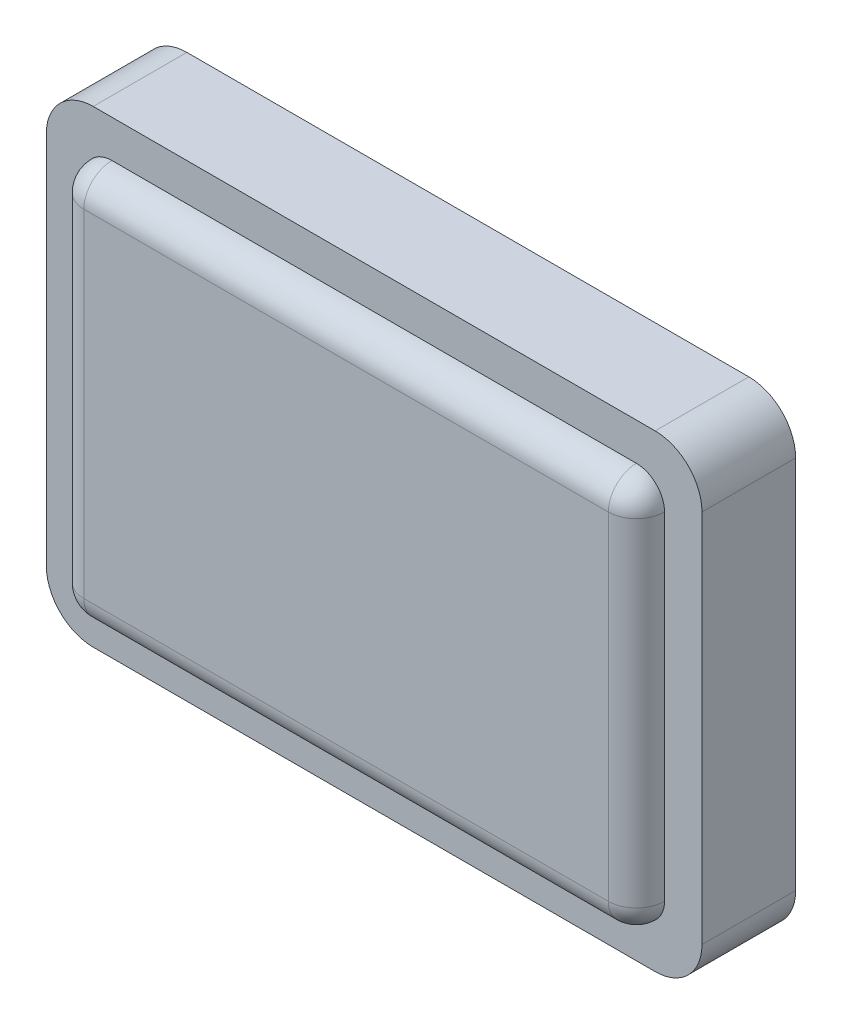
ISO-10303-21;
HEADER;
FILE_DESCRIPTION(('STEP AP214'),'2;1');
FILE_NAME('part.step','',(''),(''),'','','');
FILE_SCHEMA(('AUTOMOTIVE_DESIGN { 1 0 10303 214 1 1 1 1 }'));
ENDSEC;
DATA;
#1=APPLICATION_CONTEXT('core data for automotive mechanical design processes');
#2=APPLICATION_PROTOCOL_DEFINITION('international standard','automotive_design',2000,#1);
#3=PRODUCT_CONTEXT('',#1,'mechanical');
#4=PRODUCT('Part','Part','',(#3));
#5=PRODUCT_RELATED_PRODUCT_CATEGORY('part','',(#4));
#6=PRODUCT_DEFINITION_FORMATION('','',#4);
#7=PRODUCT_DEFINITION_CONTEXT('part definition',#1,'design');
#8=PRODUCT_DEFINITION('design','',#6,#7);
#9=PRODUCT_DEFINITION_SHAPE('','',#8);
#10=(LENGTH_UNIT() NAMED_UNIT(*) SI_UNIT(.MILLI.,.METRE.));
#11=(NAMED_UNIT(*) PLANE_ANGLE_UNIT() SI_UNIT($,.RADIAN.));
#12=(NAMED_UNIT(*) SI_UNIT($,.STERADIAN.) SOLID_ANGLE_UNIT());
#13=UNCERTAINTY_MEASURE_WITH_UNIT(LENGTH_MEASURE(1.E-05),#10,'distance_accuracy_value','');
#14=(GEOMETRIC_REPRESENTATION_CONTEXT(3) GLOBAL_UNCERTAINTY_ASSIGNED_CONTEXT((#13)) GLOBAL_UNIT_ASSIGNED_CONTEXT((#10,
#11,#12)) REPRESENTATION_CONTEXT('',''));
#15=CARTESIAN_POINT('',(0.,0.,0.));
#16=DIRECTION('',(0.,0.,1.));
#17=DIRECTION('',(1.,0.,0.));
#18=AXIS2_PLACEMENT_3D('',#15,#16,#17);
#19=CARTESIAN_POINT('',(0.,0.,1.));
#20=DIRECTION('',(0.,0.,-1.));
#21=DIRECTION('',(-1.,0.,0.));
#22=AXIS2_PLACEMENT_3D('',#19,#20,#21);
#23=PLANE('',#22);
#24=DIRECTION('',(0.,-1.,0.));
#25=VECTOR('',#24,1.);
#26=CARTESIAN_POINT('',(-3.5,-2.5,1.));
#27=LINE('',#26,#25);
#28=CARTESIAN_POINT('',(-3.5,2.,1.));
#29=VERTEX_POINT('',#28);
#30=CARTESIAN_POINT('',(-3.5,-2.,1.));
#31=VERTEX_POINT('',#30);
#32=EDGE_CURVE('E252',#29,#31,#27,.T.);
#33=ORIENTED_EDGE('',*,*,#32,.T.);
#34=CARTESIAN_POINT('',(-3.,-2.,1.));
#35=DIRECTION('',(0.,0.,-1.));
#36=DIRECTION('',(-1.,0.,0.));
#37=AXIS2_PLACEMENT_3D('',#34,#35,#36);
#38=CIRCLE('',#37,0.5);
#39=CARTESIAN_POINT('',(-3.,-2.5,1.));
#40=VERTEX_POINT('',#39);
#41=EDGE_CURVE('E185',#31,#40,#38,.F.);
#42=ORIENTED_EDGE('',*,*,#41,.T.);
#43=DIRECTION('',(1.,0.,0.));
#44=VECTOR('',#43,1.);
#45=CARTESIAN_POINT('',(-3.5,-2.5,1.));
#46=LINE('',#45,#44);
#47=CARTESIAN_POINT('',(3.,-2.5,1.));
#48=VERTEX_POINT('',#47);
#49=EDGE_CURVE('E155',#40,#48,#46,.T.);
#50=ORIENTED_EDGE('',*,*,#49,.T.);
#51=CARTESIAN_POINT('',(3.,-2.,1.));
#52=DIRECTION('',(0.,0.,-1.));
#53=DIRECTION('',(-1.,0.,0.));
#54=AXIS2_PLACEMENT_3D('',#51,#52,#53);
#55=CIRCLE('',#54,0.5);
#56=CARTESIAN_POINT('',(3.5,-2.,1.));
#57=VERTEX_POINT('',#56);
#58=EDGE_CURVE('E183',#48,#57,#55,.F.);
#59=ORIENTED_EDGE('',*,*,#58,.T.);
#60=DIRECTION('',(0.,1.,0.));
#61=VECTOR('',#60,1.);
#62=CARTESIAN_POINT('',(3.5,-2.5,1.));
#63=LINE('',#62,#61);
#64=CARTESIAN_POINT('',(3.5,2.,1.));
#65=VERTEX_POINT('',#64);
#66=EDGE_CURVE('E161',#57,#65,#63,.T.);
#67=ORIENTED_EDGE('',*,*,#66,.T.);
#68=CARTESIAN_POINT('',(3.,2.,1.));
#69=DIRECTION('',(0.,0.,-1.));
#70=DIRECTION('',(-1.,0.,0.));
#71=AXIS2_PLACEMENT_3D('',#68,#69,#70);
#72=CIRCLE('',#71,0.5);
#73=CARTESIAN_POINT('',(3.,2.5,1.));
#74=VERTEX_POINT('',#73);
#75=EDGE_CURVE('E179',#65,#74,#72,.F.);
#76=ORIENTED_EDGE('',*,*,#75,.T.);
#77=DIRECTION('',(-1.,0.,0.));
#78=VECTOR('',#77,1.);
#79=CARTESIAN_POINT('',(-3.5,2.5,1.));
#80=LINE('',#79,#78);
#81=CARTESIAN_POINT('',(-3.,2.5,1.));
#82=VERTEX_POINT('',#81);
#83=EDGE_CURVE('E165',#74,#82,#80,.T.);
#84=ORIENTED_EDGE('',*,*,#83,.T.);
#85=CARTESIAN_POINT('',(-3.,2.,1.));
#86=DIRECTION('',(0.,0.,-1.));
#87=DIRECTION('',(-1.,0.,0.));
#88=AXIS2_PLACEMENT_3D('',#85,#86,#87);
#89=CIRCLE('',#88,0.5);
#90=EDGE_CURVE('E181',#82,#29,#89,.F.);
#91=ORIENTED_EDGE('',*,*,#90,.T.);
#92=EDGE_LOOP('',(#33,#42,#50,#59,#67,#76,#84,#91));
#93=FACE_BOUND('',#92,.T.);
#94=DIRECTION('',(0.,1.,0.));
#95=VECTOR('',#94,1.);
#96=CARTESIAN_POINT('',(3.1,2.1,1.));
#97=LINE('',#96,#95);
#98=CARTESIAN_POINT('',(3.1,-1.8,1.));
#99=VERTEX_POINT('',#98);
#100=CARTESIAN_POINT('',(3.1,1.8,1.));
#101=VERTEX_POINT('',#100);
#102=EDGE_CURVE('E233',#99,#101,#97,.T.);
#103=ORIENTED_EDGE('',*,*,#102,.F.);
#104=CARTESIAN_POINT('',(2.8,-1.8,1.));
#105=DIRECTION('',(0.,0.,-1.));
#106=DIRECTION('',(-1.,0.,0.));
#107=AXIS2_PLACEMENT_3D('',#104,#105,#106);
#108=CIRCLE('',#107,0.3);
#109=CARTESIAN_POINT('',(2.8,-2.1,1.));
#110=VERTEX_POINT('',#109);
#111=EDGE_CURVE('E44',#99,#110,#108,.T.);
#112=ORIENTED_EDGE('',*,*,#111,.T.);
#113=DIRECTION('',(1.,0.,0.));
#114=VECTOR('',#113,1.);
#115=CARTESIAN_POINT('',(-3.1,-2.1,1.));
#116=LINE('',#115,#114);
#117=CARTESIAN_POINT('',(-2.8,-2.1,1.));
#118=VERTEX_POINT('',#117);
#119=EDGE_CURVE('E246',#118,#110,#116,.T.);
#120=ORIENTED_EDGE('',*,*,#119,.F.);
#121=CARTESIAN_POINT('',(-2.8,-1.8,1.));
#122=DIRECTION('',(0.,0.,-1.));
#123=DIRECTION('',(-1.,0.,0.));
#124=AXIS2_PLACEMENT_3D('',#121,#122,#123);
#125=CIRCLE('',#124,0.3);
#126=CARTESIAN_POINT('',(-3.1,-1.8,1.));
#127=VERTEX_POINT('',#126);
#128=EDGE_CURVE('E11',#118,#127,#125,.T.);
#129=ORIENTED_EDGE('',*,*,#128,.T.);
#130=DIRECTION('',(0.,-1.,0.));
#131=VECTOR('',#130,1.);
#132=CARTESIAN_POINT('',(-3.1,2.1,1.));
#133=LINE('',#132,#131);
#134=CARTESIAN_POINT('',(-3.1,1.8,1.));
#135=VERTEX_POINT('',#134);
#136=EDGE_CURVE('E54',#135,#127,#133,.T.);
#137=ORIENTED_EDGE('',*,*,#136,.F.);
#138=CARTESIAN_POINT('',(-2.8,1.8,1.));
#139=DIRECTION('',(0.,0.,-1.));
#140=DIRECTION('',(-1.,0.,0.));
#141=AXIS2_PLACEMENT_3D('',#138,#139,#140);
#142=CIRCLE('',#141,0.3);
#143=CARTESIAN_POINT('',(-2.8,2.1,1.));
#144=VERTEX_POINT('',#143);
#145=EDGE_CURVE('E206',#135,#144,#142,.T.);
#146=ORIENTED_EDGE('',*,*,#145,.T.);
#147=DIRECTION('',(-1.,0.,0.));
#148=VECTOR('',#147,1.);
#149=CARTESIAN_POINT('',(-3.1,2.1,1.));
#150=LINE('',#149,#148);
#151=CARTESIAN_POINT('',(2.8,2.1,1.));
#152=VERTEX_POINT('',#151);
#153=EDGE_CURVE('E238',#152,#144,#150,.T.);
#154=ORIENTED_EDGE('',*,*,#153,.F.);
#155=CARTESIAN_POINT('',(2.8,1.8,1.));
#156=DIRECTION('',(0.,0.,-1.));
#157=DIRECTION('',(-1.,0.,0.));
#158=AXIS2_PLACEMENT_3D('',#155,#156,#157);
#159=CIRCLE('',#158,0.3);
#160=EDGE_CURVE('E208',#152,#101,#159,.T.);
#161=ORIENTED_EDGE('',*,*,#160,.T.);
#162=EDGE_LOOP('',(#103,#112,#120,#129,#137,#146,#154,#161));
#163=FACE_BOUND('',#162,.T.);
#164=ADVANCED_FACE('F35',(#93,#163),#23,.F.);
#165=CARTESIAN_POINT('',(3.5,-2.5,1.));
#166=DIRECTION('',(-1.,0.,0.));
#167=DIRECTION('',(0.,0.,1.));
#168=AXIS2_PLACEMENT_3D('',#165,#166,#167);
#169=PLANE('',#168);
#170=ORIENTED_EDGE('',*,*,#66,.F.);
#171=DIRECTION('',(0.,0.,-1.));
#172=VECTOR('',#171,1.);
#173=CARTESIAN_POINT('',(3.5,-2.,1.));
#174=LINE('',#173,#172);
#175=CARTESIAN_POINT('',(3.5,-2.,0.));
#176=VERTEX_POINT('',#175);
#177=EDGE_CURVE('E189',#57,#176,#174,.T.);
#178=ORIENTED_EDGE('',*,*,#177,.T.);
#179=DIRECTION('',(0.,1.,0.));
#180=VECTOR('',#179,1.);
#181=CARTESIAN_POINT('',(3.5,-2.5,0.));
#182=LINE('',#181,#180);
#183=CARTESIAN_POINT('',(3.5,2.,0.));
#184=VERTEX_POINT('',#183);
#185=EDGE_CURVE('E248',#176,#184,#182,.T.);
#186=ORIENTED_EDGE('',*,*,#185,.T.);
#187=DIRECTION('',(0.,0.,-1.));
#188=VECTOR('',#187,1.);
#189=CARTESIAN_POINT('',(3.5,2.,1.));
#190=LINE('',#189,#188);
#191=EDGE_CURVE('E187',#184,#65,#190,.F.);
#192=ORIENTED_EDGE('',*,*,#191,.T.);
#193=EDGE_LOOP('',(#170,#178,#186,#192));
#194=FACE_BOUND('',#193,.T.);
#195=ADVANCED_FACE('F279',(#194),#169,.F.);
#196=CARTESIAN_POINT('',(-3.5,2.5,1.));
#197=DIRECTION('',(0.,-1.,0.));
#198=DIRECTION('',(0.,0.,-1.));
#199=AXIS2_PLACEMENT_3D('',#196,#197,#198);
#200=PLANE('',#199);
#201=DIRECTION('',(-1.,0.,0.));
#202=VECTOR('',#201,1.);
#203=CARTESIAN_POINT('',(-3.5,2.5,0.));
#204=LINE('',#203,#202);
#205=CARTESIAN_POINT('',(3.,2.5,0.));
#206=VERTEX_POINT('',#205);
#207=CARTESIAN_POINT('',(-3.,2.5,0.));
#208=VERTEX_POINT('',#207);
#209=EDGE_CURVE('E167',#206,#208,#204,.T.);
#210=ORIENTED_EDGE('',*,*,#209,.T.);
#211=DIRECTION('',(0.,0.,-1.));
#212=VECTOR('',#211,1.);
#213=CARTESIAN_POINT('',(-3.,2.5,1.));
#214=LINE('',#213,#212);
#215=EDGE_CURVE('E195',#208,#82,#214,.F.);
#216=ORIENTED_EDGE('',*,*,#215,.T.);
#217=ORIENTED_EDGE('',*,*,#83,.F.);
#218=DIRECTION('',(0.,0.,-1.));
#219=VECTOR('',#218,1.);
#220=CARTESIAN_POINT('',(3.,2.5,1.));
#221=LINE('',#220,#219);
#222=EDGE_CURVE('E192',#74,#206,#221,.T.);
#223=ORIENTED_EDGE('',*,*,#222,.T.);
#224=EDGE_LOOP('',(#210,#216,#217,#223));
#225=FACE_BOUND('',#224,.T.);
#226=ADVANCED_FACE('F261',(#225),#200,.F.);
#227=CARTESIAN_POINT('',(-3.5,-2.5,1.));
#228=DIRECTION('',(1.,0.,0.));
#229=DIRECTION('',(0.,0.,-1.));
#230=AXIS2_PLACEMENT_3D('',#227,#228,#229);
#231=PLANE('',#230);
#232=DIRECTION('',(0.,-1.,0.));
#233=VECTOR('',#232,1.);
#234=CARTESIAN_POINT('',(-3.5,-2.5,0.));
#235=LINE('',#234,#233);
#236=CARTESIAN_POINT('',(-3.5,2.,0.));
#237=VERTEX_POINT('',#236);
#238=CARTESIAN_POINT('',(-3.5,-2.,0.));
#239=VERTEX_POINT('',#238);
#240=EDGE_CURVE('E162',#237,#239,#235,.T.);
#241=ORIENTED_EDGE('',*,*,#240,.T.);
#242=DIRECTION('',(0.,0.,-1.));
#243=VECTOR('',#242,1.);
#244=CARTESIAN_POINT('',(-3.5,-2.,1.));
#245=LINE('',#244,#243);
#246=EDGE_CURVE('E140',#239,#31,#245,.F.);
#247=ORIENTED_EDGE('',*,*,#246,.T.);
#248=ORIENTED_EDGE('',*,*,#32,.F.);
#249=DIRECTION('',(0.,0.,-1.));
#250=VECTOR('',#249,1.);
#251=CARTESIAN_POINT('',(-3.5,2.,1.));
#252=LINE('',#251,#250);
#253=EDGE_CURVE('E145',#29,#237,#252,.T.);
#254=ORIENTED_EDGE('',*,*,#253,.T.);
#255=EDGE_LOOP('',(#241,#247,#248,#254));
#256=FACE_BOUND('',#255,.T.);
#257=ADVANCED_FACE('F271',(#256),#231,.F.);
#258=CARTESIAN_POINT('',(-3.5,-2.5,1.));
#259=DIRECTION('',(0.,1.,0.));
#260=DIRECTION('',(0.,0.,1.));
#261=AXIS2_PLACEMENT_3D('',#258,#259,#260);
#262=PLANE('',#261);
#263=ORIENTED_EDGE('',*,*,#49,.F.);
#264=DIRECTION('',(0.,0.,-1.));
#265=VECTOR('',#264,1.);
#266=CARTESIAN_POINT('',(-3.,-2.5,1.));
#267=LINE('',#266,#265);
#268=CARTESIAN_POINT('',(-3.,-2.5,0.));
#269=VERTEX_POINT('',#268);
#270=EDGE_CURVE('E139',#40,#269,#267,.T.);
#271=ORIENTED_EDGE('',*,*,#270,.T.);
#272=DIRECTION('',(1.,0.,0.));
#273=VECTOR('',#272,1.);
#274=CARTESIAN_POINT('',(-3.5,-2.5,0.));
#275=LINE('',#274,#273);
#276=CARTESIAN_POINT('',(3.,-2.5,0.));
#277=VERTEX_POINT('',#276);
#278=EDGE_CURVE('E152',#269,#277,#275,.T.);
#279=ORIENTED_EDGE('',*,*,#278,.T.);
#280=DIRECTION('',(0.,0.,-1.));
#281=VECTOR('',#280,1.);
#282=CARTESIAN_POINT('',(3.,-2.5,1.));
#283=LINE('',#282,#281);
#284=EDGE_CURVE('E157',#277,#48,#283,.F.);
#285=ORIENTED_EDGE('',*,*,#284,.T.);
#286=EDGE_LOOP('',(#263,#271,#279,#285));
#287=FACE_BOUND('',#286,.T.);
#288=ADVANCED_FACE('F151',(#287),#262,.F.);
#289=CARTESIAN_POINT('',(0.,0.,0.));
#290=DIRECTION('',(0.,0.,-1.));
#291=DIRECTION('',(-1.,0.,0.));
#292=AXIS2_PLACEMENT_3D('',#289,#290,#291);
#293=PLANE('',#292);
#294=ORIENTED_EDGE('',*,*,#278,.F.);
#295=CARTESIAN_POINT('',(-3.,-2.,0.));
#296=DIRECTION('',(0.,0.,-1.));
#297=DIRECTION('',(-1.,0.,0.));
#298=AXIS2_PLACEMENT_3D('',#295,#296,#297);
#299=CIRCLE('',#298,0.5);
#300=EDGE_CURVE('E135',#269,#239,#299,.T.);
#301=ORIENTED_EDGE('',*,*,#300,.T.);
#302=ORIENTED_EDGE('',*,*,#240,.F.);
#303=CARTESIAN_POINT('',(-3.,2.,0.));
#304=DIRECTION('',(0.,0.,-1.));
#305=DIRECTION('',(-1.,0.,0.));
#306=AXIS2_PLACEMENT_3D('',#303,#304,#305);
#307=CIRCLE('',#306,0.5);
#308=EDGE_CURVE('E173',#237,#208,#307,.T.);
#309=ORIENTED_EDGE('',*,*,#308,.T.);
#310=ORIENTED_EDGE('',*,*,#209,.F.);
#311=CARTESIAN_POINT('',(3.,2.,0.));
#312=DIRECTION('',(0.,0.,-1.));
#313=DIRECTION('',(-1.,0.,0.));
#314=AXIS2_PLACEMENT_3D('',#311,#312,#313);
#315=CIRCLE('',#314,0.5);
#316=EDGE_CURVE('E156',#206,#184,#315,.T.);
#317=ORIENTED_EDGE('',*,*,#316,.T.);
#318=ORIENTED_EDGE('',*,*,#185,.F.);
#319=CARTESIAN_POINT('',(3.,-2.,0.));
#320=DIRECTION('',(0.,0.,-1.));
#321=DIRECTION('',(-1.,0.,0.));
#322=AXIS2_PLACEMENT_3D('',#319,#320,#321);
#323=CIRCLE('',#322,0.5);
#324=EDGE_CURVE('E146',#176,#277,#323,.T.);
#325=ORIENTED_EDGE('',*,*,#324,.T.);
#326=EDGE_LOOP('',(#294,#301,#302,#309,#310,#317,#318,#325));
#327=FACE_BOUND('',#326,.T.);
#328=ADVANCED_FACE('F159',(#327),#293,.T.);
#329=CARTESIAN_POINT('',(-3.,-2.,1.));
#330=DIRECTION('',(0.,0.,-1.));
#331=DIRECTION('',(-1.,0.,0.));
#332=AXIS2_PLACEMENT_3D('',#329,#330,#331);
#333=CYLINDRICAL_SURFACE('',#332,0.5);
#334=ORIENTED_EDGE('',*,*,#41,.F.);
#335=ORIENTED_EDGE('',*,*,#246,.F.);
#336=ORIENTED_EDGE('',*,*,#300,.F.);
#337=ORIENTED_EDGE('',*,*,#270,.F.);
#338=EDGE_LOOP('',(#334,#335,#336,#337));
#339=FACE_BOUND('',#338,.T.);
#340=ADVANCED_FACE('F138',(#339),#333,.T.);
#341=CARTESIAN_POINT('',(3.,-2.,1.));
#342=DIRECTION('',(0.,0.,-1.));
#343=DIRECTION('',(-1.,0.,0.));
#344=AXIS2_PLACEMENT_3D('',#341,#342,#343);
#345=CYLINDRICAL_SURFACE('',#344,0.5);
#346=ORIENTED_EDGE('',*,*,#58,.F.);
#347=ORIENTED_EDGE('',*,*,#284,.F.);
#348=ORIENTED_EDGE('',*,*,#324,.F.);
#349=ORIENTED_EDGE('',*,*,#177,.F.);
#350=EDGE_LOOP('',(#346,#347,#348,#349));
#351=FACE_BOUND('',#350,.T.);
#352=ADVANCED_FACE('F295',(#351),#345,.T.);
#353=CARTESIAN_POINT('',(-3.,2.,1.));
#354=DIRECTION('',(0.,0.,-1.));
#355=DIRECTION('',(-1.,0.,0.));
#356=AXIS2_PLACEMENT_3D('',#353,#354,#355);
#357=CYLINDRICAL_SURFACE('',#356,0.5);
#358=ORIENTED_EDGE('',*,*,#90,.F.);
#359=ORIENTED_EDGE('',*,*,#215,.F.);
#360=ORIENTED_EDGE('',*,*,#308,.F.);
#361=ORIENTED_EDGE('',*,*,#253,.F.);
#362=EDGE_LOOP('',(#358,#359,#360,#361));
#363=FACE_BOUND('',#362,.T.);
#364=ADVANCED_FACE('F266',(#363),#357,.T.);
#365=CARTESIAN_POINT('',(3.,2.,1.));
#366=DIRECTION('',(0.,0.,-1.));
#367=DIRECTION('',(-1.,0.,0.));
#368=AXIS2_PLACEMENT_3D('',#365,#366,#367);
#369=CYLINDRICAL_SURFACE('',#368,0.5);
#370=ORIENTED_EDGE('',*,*,#75,.F.);
#371=ORIENTED_EDGE('',*,*,#191,.F.);
#372=ORIENTED_EDGE('',*,*,#316,.F.);
#373=ORIENTED_EDGE('',*,*,#222,.F.);
#374=EDGE_LOOP('',(#370,#371,#372,#373));
#375=FACE_BOUND('',#374,.T.);
#376=ADVANCED_FACE('F305',(#375),#369,.T.);
#377=CARTESIAN_POINT('',(0.,0.,1.3));
#378=DIRECTION('',(0.,0.,1.));
#379=DIRECTION('',(1.,0.,0.));
#380=AXIS2_PLACEMENT_3D('',#377,#378,#379);
#381=PLANE('',#380);
#382=DIRECTION('',(0.,-1.,0.));
#383=VECTOR('',#382,1.);
#384=CARTESIAN_POINT('',(-2.8,-2.1,1.3));
#385=LINE('',#384,#383);
#386=CARTESIAN_POINT('',(-2.8,1.8,1.3));
#387=VERTEX_POINT('',#386);
#388=CARTESIAN_POINT('',(-2.8,-1.8,1.3));
#389=VERTEX_POINT('',#388);
#390=EDGE_CURVE('E197',#387,#389,#385,.T.);
#391=ORIENTED_EDGE('',*,*,#390,.T.);
#392=DIRECTION('',(1.,0.,0.));
#393=VECTOR('',#392,1.);
#394=CARTESIAN_POINT('',(3.1,-1.8,1.3));
#395=LINE('',#394,#393);
#396=CARTESIAN_POINT('',(2.8,-1.8,1.3));
#397=VERTEX_POINT('',#396);
#398=EDGE_CURVE('E203',#389,#397,#395,.T.);
#399=ORIENTED_EDGE('',*,*,#398,.T.);
#400=DIRECTION('',(0.,1.,0.));
#401=VECTOR('',#400,1.);
#402=CARTESIAN_POINT('',(2.8,2.1,1.3));
#403=LINE('',#402,#401);
#404=CARTESIAN_POINT('',(2.8,1.8,1.3));
#405=VERTEX_POINT('',#404);
#406=EDGE_CURVE('E201',#397,#405,#403,.T.);
#407=ORIENTED_EDGE('',*,*,#406,.T.);
#408=DIRECTION('',(-1.,0.,0.));
#409=VECTOR('',#408,1.);
#410=CARTESIAN_POINT('',(-3.1,1.8,1.3));
#411=LINE('',#410,#409);
#412=EDGE_CURVE('E199',#405,#387,#411,.T.);
#413=ORIENTED_EDGE('',*,*,#412,.T.);
#414=EDGE_LOOP('',(#391,#399,#407,#413));
#415=FACE_BOUND('',#414,.T.);
#416=ADVANCED_FACE('F290',(#415),#381,.T.);
#417=CARTESIAN_POINT('',(0.,1.8,1.));
#418=DIRECTION('',(1.,0.,0.));
#419=DIRECTION('',(0.,0.,-1.));
#420=AXIS2_PLACEMENT_3D('',#417,#418,#419);
#421=CYLINDRICAL_SURFACE('',#420,0.3);
#422=CARTESIAN_POINT('',(2.8,1.8,1.));
#423=DIRECTION('',(1.,0.,0.));
#424=DIRECTION('',(0.,0.,-1.));
#425=AXIS2_PLACEMENT_3D('',#422,#423,#424);
#426=CIRCLE('',#425,0.3);
#427=EDGE_CURVE('E226',#152,#405,#426,.T.);
#428=ORIENTED_EDGE('',*,*,#427,.F.);
#429=ORIENTED_EDGE('',*,*,#153,.T.);
#430=CARTESIAN_POINT('',(-2.8,1.8,1.));
#431=DIRECTION('',(-1.,0.,0.));
#432=DIRECTION('',(0.,0.,1.));
#433=AXIS2_PLACEMENT_3D('',#430,#431,#432);
#434=CIRCLE('',#433,0.3);
#435=EDGE_CURVE('E39',#387,#144,#434,.T.);
#436=ORIENTED_EDGE('',*,*,#435,.F.);
#437=ORIENTED_EDGE('',*,*,#412,.F.);
#438=EDGE_LOOP('',(#428,#429,#436,#437));
#439=FACE_BOUND('',#438,.T.);
#440=ADVANCED_FACE('F37',(#439),#421,.T.);
#441=CARTESIAN_POINT('',(-2.8,1.8,1.));
#442=DIRECTION('',(0.,0.,1.));
#443=DIRECTION('',(1.,0.,0.));
#444=AXIS2_PLACEMENT_3D('',#441,#442,#443);
#445=SPHERICAL_SURFACE('',#444,0.3);
#446=ORIENTED_EDGE('',*,*,#435,.T.);
#447=ORIENTED_EDGE('',*,*,#145,.F.);
#448=CARTESIAN_POINT('',(-2.8,1.8,1.));
#449=DIRECTION('',(0.,1.,0.));
#450=DIRECTION('',(0.,0.,1.));
#451=AXIS2_PLACEMENT_3D('',#448,#449,#450);
#452=CIRCLE('',#451,0.3);
#453=EDGE_CURVE('E224',#387,#135,#452,.F.);
#454=ORIENTED_EDGE('',*,*,#453,.F.);
#455=EDGE_LOOP('',(#446,#447,#454));
#456=FACE_BOUND('',#455,.T.);
#457=ADVANCED_FACE('F330',(#456),#445,.T.);
#458=CARTESIAN_POINT('',(2.8,1.8,1.));
#459=DIRECTION('',(0.,0.,1.));
#460=DIRECTION('',(1.,0.,0.));
#461=AXIS2_PLACEMENT_3D('',#458,#459,#460);
#462=SPHERICAL_SURFACE('',#461,0.3);
#463=ORIENTED_EDGE('',*,*,#160,.F.);
#464=ORIENTED_EDGE('',*,*,#427,.T.);
#465=CARTESIAN_POINT('',(2.8,1.8,1.));
#466=DIRECTION('',(0.,1.,0.));
#467=DIRECTION('',(0.,0.,1.));
#468=AXIS2_PLACEMENT_3D('',#465,#466,#467);
#469=CIRCLE('',#468,0.3);
#470=EDGE_CURVE('E221',#101,#405,#469,.F.);
#471=ORIENTED_EDGE('',*,*,#470,.F.);
#472=EDGE_LOOP('',(#463,#464,#471));
#473=FACE_BOUND('',#472,.T.);
#474=ADVANCED_FACE('F327',(#473),#462,.T.);
#475=CARTESIAN_POINT('',(-2.8,0.,1.));
#476=DIRECTION('',(0.,1.,0.));
#477=DIRECTION('',(0.,0.,1.));
#478=AXIS2_PLACEMENT_3D('',#475,#476,#477);
#479=CYLINDRICAL_SURFACE('',#478,0.3);
#480=ORIENTED_EDGE('',*,*,#453,.T.);
#481=ORIENTED_EDGE('',*,*,#136,.T.);
#482=CARTESIAN_POINT('',(-2.8,-1.8,1.));
#483=DIRECTION('',(0.,-1.,0.));
#484=DIRECTION('',(0.,0.,-1.));
#485=AXIS2_PLACEMENT_3D('',#482,#483,#484);
#486=CIRCLE('',#485,0.3);
#487=EDGE_CURVE('E218',#389,#127,#486,.T.);
#488=ORIENTED_EDGE('',*,*,#487,.F.);
#489=ORIENTED_EDGE('',*,*,#390,.F.);
#490=EDGE_LOOP('',(#480,#481,#488,#489));
#491=FACE_BOUND('',#490,.T.);
#492=ADVANCED_FACE('F324',(#491),#479,.T.);
#493=CARTESIAN_POINT('',(2.8,0.,1.));
#494=DIRECTION('',(0.,-1.,0.));
#495=DIRECTION('',(0.,0.,-1.));
#496=AXIS2_PLACEMENT_3D('',#493,#494,#495);
#497=CYLINDRICAL_SURFACE('',#496,0.3);
#498=ORIENTED_EDGE('',*,*,#470,.T.);
#499=ORIENTED_EDGE('',*,*,#406,.F.);
#500=CARTESIAN_POINT('',(2.8,-1.8,1.));
#501=DIRECTION('',(0.,-1.,0.));
#502=DIRECTION('',(0.,0.,-1.));
#503=AXIS2_PLACEMENT_3D('',#500,#501,#502);
#504=CIRCLE('',#503,0.3);
#505=EDGE_CURVE('E215',#99,#397,#504,.T.);
#506=ORIENTED_EDGE('',*,*,#505,.F.);
#507=ORIENTED_EDGE('',*,*,#102,.T.);
#508=EDGE_LOOP('',(#498,#499,#506,#507));
#509=FACE_BOUND('',#508,.T.);
#510=ADVANCED_FACE('F320',(#509),#497,.T.);
#511=CARTESIAN_POINT('',(-2.8,-1.8,1.));
#512=DIRECTION('',(0.,0.,1.));
#513=DIRECTION('',(1.,0.,0.));
#514=AXIS2_PLACEMENT_3D('',#511,#512,#513);
#515=SPHERICAL_SURFACE('',#514,0.3);
#516=ORIENTED_EDGE('',*,*,#487,.T.);
#517=ORIENTED_EDGE('',*,*,#128,.F.);
#518=CARTESIAN_POINT('',(-2.8,-1.8,1.));
#519=DIRECTION('',(-1.,0.,0.));
#520=DIRECTION('',(0.,0.,1.));
#521=AXIS2_PLACEMENT_3D('',#518,#519,#520);
#522=CIRCLE('',#521,0.3);
#523=EDGE_CURVE('E213',#389,#118,#522,.F.);
#524=ORIENTED_EDGE('',*,*,#523,.F.);
#525=EDGE_LOOP('',(#516,#517,#524));
#526=FACE_BOUND('',#525,.T.);
#527=ADVANCED_FACE('F316',(#526),#515,.T.);
#528=CARTESIAN_POINT('',(2.8,-1.8,1.));
#529=DIRECTION('',(0.,0.,1.));
#530=DIRECTION('',(1.,0.,0.));
#531=AXIS2_PLACEMENT_3D('',#528,#529,#530);
#532=SPHERICAL_SURFACE('',#531,0.3);
#533=ORIENTED_EDGE('',*,*,#111,.F.);
#534=ORIENTED_EDGE('',*,*,#505,.T.);
#535=CARTESIAN_POINT('',(2.8,-1.8,1.));
#536=DIRECTION('',(1.,0.,0.));
#537=DIRECTION('',(0.,0.,-1.));
#538=AXIS2_PLACEMENT_3D('',#535,#536,#537);
#539=CIRCLE('',#538,0.3);
#540=EDGE_CURVE('E211',#110,#397,#539,.F.);
#541=ORIENTED_EDGE('',*,*,#540,.F.);
#542=EDGE_LOOP('',(#533,#534,#541));
#543=FACE_BOUND('',#542,.T.);
#544=ADVANCED_FACE('F312',(#543),#532,.T.);
#545=CARTESIAN_POINT('',(0.,-1.8,1.));
#546=DIRECTION('',(-1.,0.,0.));
#547=DIRECTION('',(0.,0.,1.));
#548=AXIS2_PLACEMENT_3D('',#545,#546,#547);
#549=CYLINDRICAL_SURFACE('',#548,0.3);
#550=ORIENTED_EDGE('',*,*,#523,.T.);
#551=ORIENTED_EDGE('',*,*,#119,.T.);
#552=ORIENTED_EDGE('',*,*,#540,.T.);
#553=ORIENTED_EDGE('',*,*,#398,.F.);
#554=EDGE_LOOP('',(#550,#551,#552,#553));
#555=FACE_BOUND('',#554,.T.);
#556=ADVANCED_FACE('F309',(#555),#549,.T.);
#557=CLOSED_SHELL('',(#164,#195,#226,#257,#288,#328,#340,#352,#364,#376,#416,#440,#457,#474,
#492,#510,#527,#544,#556));
#558=MANIFOLD_SOLID_BREP('B2',#557);
#559=ADVANCED_BREP_SHAPE_REPRESENTATION('',(#18,#558),#14);
#560=SHAPE_DEFINITION_REPRESENTATION(#9,#559);
ENDSEC;
END-ISO-10303-21;
